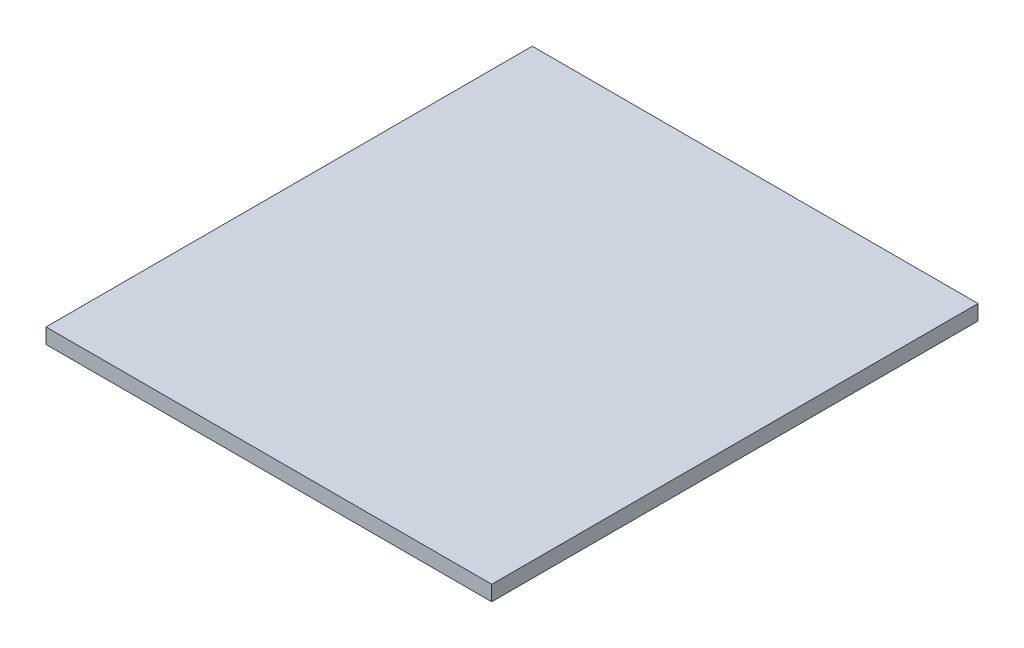
ISO-10303-21;
HEADER;
FILE_DESCRIPTION(('STEP AP214'),'2;1');
FILE_NAME('part.step','',(''),(''),'','','');
FILE_SCHEMA(('AUTOMOTIVE_DESIGN { 1 0 10303 214 1 1 1 1 }'));
ENDSEC;
DATA;
#1=APPLICATION_CONTEXT('core data for automotive mechanical design processes');
#2=APPLICATION_PROTOCOL_DEFINITION('international standard','automotive_design',2000,#1);
#3=PRODUCT_CONTEXT('',#1,'mechanical');
#4=PRODUCT('Part','Part','',(#3));
#5=PRODUCT_RELATED_PRODUCT_CATEGORY('part','',(#4));
#6=PRODUCT_DEFINITION_FORMATION('','',#4);
#7=PRODUCT_DEFINITION_CONTEXT('part definition',#1,'design');
#8=PRODUCT_DEFINITION('design','',#6,#7);
#9=PRODUCT_DEFINITION_SHAPE('','',#8);
#10=(LENGTH_UNIT() NAMED_UNIT(*) SI_UNIT(.MILLI.,.METRE.));
#11=(NAMED_UNIT(*) PLANE_ANGLE_UNIT() SI_UNIT($,.RADIAN.));
#12=(NAMED_UNIT(*) SI_UNIT($,.STERADIAN.) SOLID_ANGLE_UNIT());
#13=UNCERTAINTY_MEASURE_WITH_UNIT(LENGTH_MEASURE(1.E-05),#10,'distance_accuracy_value','');
#14=(GEOMETRIC_REPRESENTATION_CONTEXT(3) GLOBAL_UNCERTAINTY_ASSIGNED_CONTEXT((#13)) GLOBAL_UNIT_ASSIGNED_CONTEXT((#10,
#11,#12)) REPRESENTATION_CONTEXT('',''));
#15=CARTESIAN_POINT('',(0.,0.,0.));
#16=DIRECTION('',(0.,0.,1.));
#17=DIRECTION('',(1.,0.,0.));
#18=AXIS2_PLACEMENT_3D('',#15,#16,#17);
#19=CARTESIAN_POINT('',(-268.35,-136.525,114.3));
#20=DIRECTION('',(1.,0.,0.));
#21=DIRECTION('',(0.,0.,-1.));
#22=AXIS2_PLACEMENT_3D('',#19,#20,#21);
#23=PLANE('',#22);
#24=DIRECTION('',(0.,0.,-1.));
#25=VECTOR('',#24,1.);
#26=CARTESIAN_POINT('',(-268.35,-127.,114.3));
#27=LINE('',#26,#25);
#28=CARTESIAN_POINT('',(-268.35,-127.,114.3));
#29=VERTEX_POINT('',#28);
#30=CARTESIAN_POINT('',(-268.35,-127.,-190.5));
#31=VERTEX_POINT('',#30);
#32=EDGE_CURVE('E102',#29,#31,#27,.T.);
#33=ORIENTED_EDGE('',*,*,#32,.T.);
#34=DIRECTION('',(0.,1.,0.));
#35=VECTOR('',#34,1.);
#36=CARTESIAN_POINT('',(-268.35,-136.525,-190.5));
#37=LINE('',#36,#35);
#38=CARTESIAN_POINT('',(-268.35,-136.525,-190.5));
#39=VERTEX_POINT('',#38);
#40=EDGE_CURVE('E11',#39,#31,#37,.T.);
#41=ORIENTED_EDGE('',*,*,#40,.F.);
#42=DIRECTION('',(0.,0.,-1.));
#43=VECTOR('',#42,1.);
#44=CARTESIAN_POINT('',(-268.35,-136.525,114.3));
#45=LINE('',#44,#43);
#46=CARTESIAN_POINT('',(-268.35,-136.525,114.3));
#47=VERTEX_POINT('',#46);
#48=EDGE_CURVE('E90',#47,#39,#45,.T.);
#49=ORIENTED_EDGE('',*,*,#48,.F.);
#50=DIRECTION('',(0.,1.,0.));
#51=VECTOR('',#50,1.);
#52=CARTESIAN_POINT('',(-268.35,-136.525,114.3));
#53=LINE('',#52,#51);
#54=EDGE_CURVE('E98',#47,#29,#53,.T.);
#55=ORIENTED_EDGE('',*,*,#54,.T.);
#56=EDGE_LOOP('',(#33,#41,#49,#55));
#57=FACE_BOUND('',#56,.T.);
#58=ADVANCED_FACE('F39',(#57),#23,.F.);
#59=CARTESIAN_POINT('',(-268.35,-136.525,-190.5));
#60=DIRECTION('',(0.,0.,1.));
#61=DIRECTION('',(0.,-1.,0.));
#62=AXIS2_PLACEMENT_3D('',#59,#60,#61);
#63=PLANE('',#62);
#64=DIRECTION('',(1.,0.,0.));
#65=VECTOR('',#64,1.);
#66=CARTESIAN_POINT('',(-268.35,-127.,-190.5));
#67=LINE('',#66,#65);
#68=CARTESIAN_POINT('',(11.0500000000001,-127.,-190.5));
#69=VERTEX_POINT('',#68);
#70=EDGE_CURVE('E94',#31,#69,#67,.T.);
#71=ORIENTED_EDGE('',*,*,#70,.T.);
#72=DIRECTION('',(0.,1.,0.));
#73=VECTOR('',#72,1.);
#74=CARTESIAN_POINT('',(11.0500000000001,-136.525,-190.5));
#75=LINE('',#74,#73);
#76=CARTESIAN_POINT('',(11.0500000000001,-136.525,-190.5));
#77=VERTEX_POINT('',#76);
#78=EDGE_CURVE('E47',#77,#69,#75,.T.);
#79=ORIENTED_EDGE('',*,*,#78,.F.);
#80=DIRECTION('',(1.,0.,0.));
#81=VECTOR('',#80,1.);
#82=CARTESIAN_POINT('',(-268.35,-136.525,-190.5));
#83=LINE('',#82,#81);
#84=EDGE_CURVE('E85',#39,#77,#83,.T.);
#85=ORIENTED_EDGE('',*,*,#84,.F.);
#86=ORIENTED_EDGE('',*,*,#40,.T.);
#87=EDGE_LOOP('',(#71,#79,#85,#86));
#88=FACE_BOUND('',#87,.T.);
#89=ADVANCED_FACE('F93',(#88),#63,.F.);
#90=CARTESIAN_POINT('',(11.0500000000001,-136.525,114.3));
#91=DIRECTION('',(-1.,0.,0.));
#92=DIRECTION('',(0.,0.,1.));
#93=AXIS2_PLACEMENT_3D('',#90,#91,#92);
#94=PLANE('',#93);
#95=DIRECTION('',(0.,0.,1.));
#96=VECTOR('',#95,1.);
#97=CARTESIAN_POINT('',(11.0500000000001,-127.,114.3));
#98=LINE('',#97,#96);
#99=CARTESIAN_POINT('',(11.0500000000001,-127.,114.3));
#100=VERTEX_POINT('',#99);
#101=EDGE_CURVE('E72',#69,#100,#98,.T.);
#102=ORIENTED_EDGE('',*,*,#101,.T.);
#103=DIRECTION('',(0.,1.,0.));
#104=VECTOR('',#103,1.);
#105=CARTESIAN_POINT('',(11.0500000000001,-136.525,114.3));
#106=LINE('',#105,#104);
#107=CARTESIAN_POINT('',(11.0500000000001,-136.525,114.3));
#108=VERTEX_POINT('',#107);
#109=EDGE_CURVE('E95',#108,#100,#106,.T.);
#110=ORIENTED_EDGE('',*,*,#109,.F.);
#111=DIRECTION('',(0.,0.,1.));
#112=VECTOR('',#111,1.);
#113=CARTESIAN_POINT('',(11.0500000000001,-136.525,114.3));
#114=LINE('',#113,#112);
#115=EDGE_CURVE('E88',#77,#108,#114,.T.);
#116=ORIENTED_EDGE('',*,*,#115,.F.);
#117=ORIENTED_EDGE('',*,*,#78,.T.);
#118=EDGE_LOOP('',(#102,#110,#116,#117));
#119=FACE_BOUND('',#118,.T.);
#120=ADVANCED_FACE('F96',(#119),#94,.F.);
#121=CARTESIAN_POINT('',(-268.35,-136.525,114.3));
#122=DIRECTION('',(0.,0.,-1.));
#123=DIRECTION('',(0.,1.,0.));
#124=AXIS2_PLACEMENT_3D('',#121,#122,#123);
#125=PLANE('',#124);
#126=DIRECTION('',(-1.,0.,0.));
#127=VECTOR('',#126,1.);
#128=CARTESIAN_POINT('',(-268.35,-127.,114.3));
#129=LINE('',#128,#127);
#130=EDGE_CURVE('E78',#100,#29,#129,.T.);
#131=ORIENTED_EDGE('',*,*,#130,.T.);
#132=ORIENTED_EDGE('',*,*,#54,.F.);
#133=DIRECTION('',(-1.,0.,0.));
#134=VECTOR('',#133,1.);
#135=CARTESIAN_POINT('',(-268.35,-136.525,114.3));
#136=LINE('',#135,#134);
#137=EDGE_CURVE('E55',#108,#47,#136,.T.);
#138=ORIENTED_EDGE('',*,*,#137,.F.);
#139=ORIENTED_EDGE('',*,*,#109,.T.);
#140=EDGE_LOOP('',(#131,#132,#138,#139));
#141=FACE_BOUND('',#140,.T.);
#142=ADVANCED_FACE('F109',(#141),#125,.F.);
#143=CARTESIAN_POINT('',(0.,-136.525,0.));
#144=DIRECTION('',(0.,-1.,0.));
#145=DIRECTION('',(0.,0.,-1.));
#146=AXIS2_PLACEMENT_3D('',#143,#144,#145);
#147=PLANE('',#146);
#148=ORIENTED_EDGE('',*,*,#48,.T.);
#149=ORIENTED_EDGE('',*,*,#84,.T.);
#150=ORIENTED_EDGE('',*,*,#115,.T.);
#151=ORIENTED_EDGE('',*,*,#137,.T.);
#152=EDGE_LOOP('',(#148,#149,#150,#151));
#153=FACE_BOUND('',#152,.T.);
#154=ADVANCED_FACE('F86',(#153),#147,.T.);
#155=CARTESIAN_POINT('',(0.,-127.,0.));
#156=DIRECTION('',(0.,-1.,0.));
#157=DIRECTION('',(0.,0.,-1.));
#158=AXIS2_PLACEMENT_3D('',#155,#156,#157);
#159=PLANE('',#158);
#160=ORIENTED_EDGE('',*,*,#32,.F.);
#161=ORIENTED_EDGE('',*,*,#130,.F.);
#162=ORIENTED_EDGE('',*,*,#101,.F.);
#163=ORIENTED_EDGE('',*,*,#70,.F.);
#164=EDGE_LOOP('',(#160,#161,#162,#163));
#165=FACE_BOUND('',#164,.T.);
#166=ADVANCED_FACE('F112',(#165),#159,.F.);
#167=CLOSED_SHELL('',(#58,#89,#120,#142,#154,#166));
#168=MANIFOLD_SOLID_BREP('B2',#167);
#169=ADVANCED_BREP_SHAPE_REPRESENTATION('',(#18,#168),#14);
#170=SHAPE_DEFINITION_REPRESENTATION(#9,#169);
ENDSEC;
END-ISO-10303-21;
